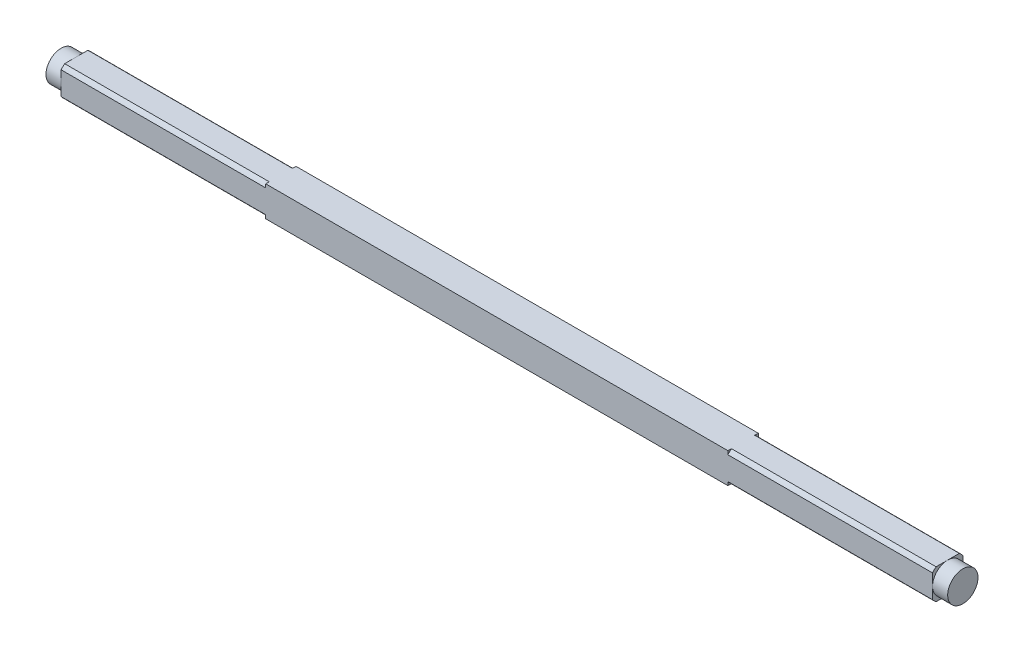
ISO-10303-21;
HEADER;
FILE_DESCRIPTION(('STEP AP214'),'2;1');
FILE_NAME('part.step','',(''),(''),'','','');
FILE_SCHEMA(('AUTOMOTIVE_DESIGN { 1 0 10303 214 1 1 1 1 }'));
ENDSEC;
DATA;
#1=APPLICATION_CONTEXT('core data for automotive mechanical design processes');
#2=APPLICATION_PROTOCOL_DEFINITION('international standard','automotive_design',2000,#1);
#3=PRODUCT_CONTEXT('',#1,'mechanical');
#4=PRODUCT('Part','Part','',(#3));
#5=PRODUCT_RELATED_PRODUCT_CATEGORY('part','',(#4));
#6=PRODUCT_DEFINITION_FORMATION('','',#4);
#7=PRODUCT_DEFINITION_CONTEXT('part definition',#1,'design');
#8=PRODUCT_DEFINITION('design','',#6,#7);
#9=PRODUCT_DEFINITION_SHAPE('','',#8);
#10=(LENGTH_UNIT() NAMED_UNIT(*) SI_UNIT(.MILLI.,.METRE.));
#11=(NAMED_UNIT(*) PLANE_ANGLE_UNIT() SI_UNIT($,.RADIAN.));
#12=(NAMED_UNIT(*) SI_UNIT($,.STERADIAN.) SOLID_ANGLE_UNIT());
#13=UNCERTAINTY_MEASURE_WITH_UNIT(LENGTH_MEASURE(1.E-05),#10,'distance_accuracy_value','');
#14=(GEOMETRIC_REPRESENTATION_CONTEXT(3) GLOBAL_UNCERTAINTY_ASSIGNED_CONTEXT((#13)) GLOBAL_UNIT_ASSIGNED_CONTEXT((#10,
#11,#12)) REPRESENTATION_CONTEXT('',''));
#15=CARTESIAN_POINT('',(0.,0.,0.));
#16=DIRECTION('',(0.,0.,1.));
#17=DIRECTION('',(1.,0.,0.));
#18=AXIS2_PLACEMENT_3D('',#15,#16,#17);
#19=CARTESIAN_POINT('',(94.45625,-3.175,3.175));
#20=DIRECTION('',(0.,0.,-1.));
#21=DIRECTION('',(-1.,0.,0.));
#22=AXIS2_PLACEMENT_3D('',#19,#20,#21);
#23=PLANE('',#22);
#24=DIRECTION('',(0.,-1.,0.));
#25=VECTOR('',#24,1.);
#26=CARTESIAN_POINT('',(48.41875,3.175,3.175));
#27=LINE('',#26,#25);
#28=CARTESIAN_POINT('',(48.41875,3.175,3.175));
#29=VERTEX_POINT('',#28);
#30=CARTESIAN_POINT('',(48.41875,2.43297657202037,3.175));
#31=VERTEX_POINT('',#30);
#32=EDGE_CURVE('E263',#29,#31,#27,.T.);
#33=ORIENTED_EDGE('',*,*,#32,.F.);
#34=DIRECTION('',(-1.,0.,0.));
#35=VECTOR('',#34,1.);
#36=CARTESIAN_POINT('',(94.45625,3.175,3.175));
#37=LINE('',#36,#35);
#38=CARTESIAN_POINT('',(-48.41875,3.175,3.175));
#39=VERTEX_POINT('',#38);
#40=EDGE_CURVE('E314',#29,#39,#37,.T.);
#41=ORIENTED_EDGE('',*,*,#40,.T.);
#42=DIRECTION('',(0.,-1.,0.));
#43=VECTOR('',#42,1.);
#44=CARTESIAN_POINT('',(-48.41875,3.175,3.175));
#45=LINE('',#44,#43);
#46=CARTESIAN_POINT('',(-48.41875,2.43297657202037,3.175));
#47=VERTEX_POINT('',#46);
#48=EDGE_CURVE('E348',#39,#47,#45,.T.);
#49=ORIENTED_EDGE('',*,*,#48,.T.);
#50=DIRECTION('',(-1.,0.,0.));
#51=VECTOR('',#50,1.);
#52=CARTESIAN_POINT('',(-48.41875,2.43297657202037,3.175));
#53=LINE('',#52,#51);
#54=CARTESIAN_POINT('',(-91.28125,2.43297657202037,3.175));
#55=VERTEX_POINT('',#54);
#56=EDGE_CURVE('E358',#47,#55,#53,.T.);
#57=ORIENTED_EDGE('',*,*,#56,.T.);
#58=DIRECTION('',(0.,-1.,0.));
#59=VECTOR('',#58,1.);
#60=CARTESIAN_POINT('',(-91.28125,-3.175,3.175));
#61=LINE('',#60,#59);
#62=CARTESIAN_POINT('',(-91.28125,0.,3.175));
#63=VERTEX_POINT('',#62);
#64=EDGE_CURVE('E230',#55,#63,#61,.T.);
#65=ORIENTED_EDGE('',*,*,#64,.T.);
#66=CARTESIAN_POINT('',(-91.28125,-2.43297657202037,3.175));
#67=VERTEX_POINT('',#66);
#68=EDGE_CURVE('E204',#63,#67,#61,.T.);
#69=ORIENTED_EDGE('',*,*,#68,.T.);
#70=DIRECTION('',(-1.,0.,0.));
#71=VECTOR('',#70,1.);
#72=CARTESIAN_POINT('',(-48.41875,-2.43297657202037,3.175));
#73=LINE('',#72,#71);
#74=CARTESIAN_POINT('',(-48.41875,-2.43297657202037,3.175));
#75=VERTEX_POINT('',#74);
#76=EDGE_CURVE('E214',#75,#67,#73,.T.);
#77=ORIENTED_EDGE('',*,*,#76,.F.);
#78=DIRECTION('',(0.,-1.,0.));
#79=VECTOR('',#78,1.);
#80=CARTESIAN_POINT('',(-48.41875,-2.43297657202037,3.175));
#81=LINE('',#80,#79);
#82=CARTESIAN_POINT('',(-48.41875,-3.175,3.175));
#83=VERTEX_POINT('',#82);
#84=EDGE_CURVE('E450',#75,#83,#81,.T.);
#85=ORIENTED_EDGE('',*,*,#84,.T.);
#86=DIRECTION('',(-1.,0.,0.));
#87=VECTOR('',#86,1.);
#88=CARTESIAN_POINT('',(94.45625,-3.175,3.175));
#89=LINE('',#88,#87);
#90=CARTESIAN_POINT('',(48.41875,-3.175,3.175));
#91=VERTEX_POINT('',#90);
#92=EDGE_CURVE('E317',#91,#83,#89,.T.);
#93=ORIENTED_EDGE('',*,*,#92,.F.);
#94=DIRECTION('',(0.,-1.,0.));
#95=VECTOR('',#94,1.);
#96=CARTESIAN_POINT('',(48.41875,-2.43297657202037,3.175));
#97=LINE('',#96,#95);
#98=CARTESIAN_POINT('',(48.41875,-2.43297657202037,3.175));
#99=VERTEX_POINT('',#98);
#100=EDGE_CURVE('E236',#99,#91,#97,.T.);
#101=ORIENTED_EDGE('',*,*,#100,.F.);
#102=DIRECTION('',(1.,0.,0.));
#103=VECTOR('',#102,1.);
#104=CARTESIAN_POINT('',(48.41875,-2.43297657202037,3.175));
#105=LINE('',#104,#103);
#106=CARTESIAN_POINT('',(91.28125,-2.43297657202037,3.175));
#107=VERTEX_POINT('',#106);
#108=EDGE_CURVE('E239',#99,#107,#105,.T.);
#109=ORIENTED_EDGE('',*,*,#108,.T.);
#110=DIRECTION('',(0.,-1.,0.));
#111=VECTOR('',#110,1.);
#112=CARTESIAN_POINT('',(91.28125,-3.175,3.175));
#113=LINE('',#112,#111);
#114=CARTESIAN_POINT('',(91.28125,0.,3.175));
#115=VERTEX_POINT('',#114);
#116=EDGE_CURVE('E309',#115,#107,#113,.T.);
#117=ORIENTED_EDGE('',*,*,#116,.F.);
#118=CARTESIAN_POINT('',(91.28125,2.43297657202037,3.175));
#119=VERTEX_POINT('',#118);
#120=EDGE_CURVE('E311',#119,#115,#113,.T.);
#121=ORIENTED_EDGE('',*,*,#120,.F.);
#122=DIRECTION('',(1.,0.,0.));
#123=VECTOR('',#122,1.);
#124=CARTESIAN_POINT('',(48.41875,2.43297657202037,3.175));
#125=LINE('',#124,#123);
#126=EDGE_CURVE('E52',#31,#119,#125,.T.);
#127=ORIENTED_EDGE('',*,*,#126,.F.);
#128=EDGE_LOOP('',(#33,#41,#49,#57,#65,#69,#77,#85,#93,#101,#109,#117,#121,#127));
#129=FACE_BOUND('',#128,.T.);
#130=ADVANCED_FACE('F39',(#129),#23,.F.);
#131=CARTESIAN_POINT('',(94.45625,-3.175,-3.175));
#132=DIRECTION('',(0.,1.,0.));
#133=DIRECTION('',(0.,0.,1.));
#134=AXIS2_PLACEMENT_3D('',#131,#132,#133);
#135=PLANE('',#134);
#136=DIRECTION('',(0.,0.,-1.));
#137=VECTOR('',#136,1.);
#138=CARTESIAN_POINT('',(48.41875,-3.175,-2.43297657202037));
#139=LINE('',#138,#137);
#140=CARTESIAN_POINT('',(48.41875,-3.175,-2.43297657202037));
#141=VERTEX_POINT('',#140);
#142=CARTESIAN_POINT('',(48.41875,-3.175,-3.175));
#143=VERTEX_POINT('',#142);
#144=EDGE_CURVE('E268',#141,#143,#139,.T.);
#145=ORIENTED_EDGE('',*,*,#144,.F.);
#146=DIRECTION('',(1.,0.,0.));
#147=VECTOR('',#146,1.);
#148=CARTESIAN_POINT('',(48.41875,-3.175,-2.43297657202037));
#149=LINE('',#148,#147);
#150=CARTESIAN_POINT('',(91.28125,-3.175,-2.43297657202037));
#151=VERTEX_POINT('',#150);
#152=EDGE_CURVE('E267',#141,#151,#149,.T.);
#153=ORIENTED_EDGE('',*,*,#152,.T.);
#154=DIRECTION('',(0.,0.,-1.));
#155=VECTOR('',#154,1.);
#156=CARTESIAN_POINT('',(91.28125,-3.175,-3.175));
#157=LINE('',#156,#155);
#158=CARTESIAN_POINT('',(91.28125,-3.175,0.));
#159=VERTEX_POINT('',#158);
#160=EDGE_CURVE('E308',#159,#151,#157,.T.);
#161=ORIENTED_EDGE('',*,*,#160,.F.);
#162=CARTESIAN_POINT('',(91.28125,-3.175,2.43297657202037));
#163=VERTEX_POINT('',#162);
#164=EDGE_CURVE('E310',#163,#159,#157,.T.);
#165=ORIENTED_EDGE('',*,*,#164,.F.);
#166=DIRECTION('',(1.,0.,0.));
#167=VECTOR('',#166,1.);
#168=CARTESIAN_POINT('',(48.41875,-3.175,2.43297657202038));
#169=LINE('',#168,#167);
#170=CARTESIAN_POINT('',(48.41875,-3.175,2.43297657202038));
#171=VERTEX_POINT('',#170);
#172=EDGE_CURVE('E61',#171,#163,#169,.T.);
#173=ORIENTED_EDGE('',*,*,#172,.F.);
#174=DIRECTION('',(0.,0.,-1.));
#175=VECTOR('',#174,1.);
#176=CARTESIAN_POINT('',(48.41875,-3.175,3.175));
#177=LINE('',#176,#175);
#178=EDGE_CURVE('E248',#91,#171,#177,.T.);
#179=ORIENTED_EDGE('',*,*,#178,.F.);
#180=ORIENTED_EDGE('',*,*,#92,.T.);
#181=DIRECTION('',(0.,0.,-1.));
#182=VECTOR('',#181,1.);
#183=CARTESIAN_POINT('',(-48.41875,-3.175,3.175));
#184=LINE('',#183,#182);
#185=CARTESIAN_POINT('',(-48.41875,-3.175,2.43297657202038));
#186=VERTEX_POINT('',#185);
#187=EDGE_CURVE('E215',#83,#186,#184,.T.);
#188=ORIENTED_EDGE('',*,*,#187,.T.);
#189=DIRECTION('',(-1.,0.,0.));
#190=VECTOR('',#189,1.);
#191=CARTESIAN_POINT('',(-48.41875,-3.175,2.43297657202038));
#192=LINE('',#191,#190);
#193=CARTESIAN_POINT('',(-91.28125,-3.175,2.43297657202037));
#194=VERTEX_POINT('',#193);
#195=EDGE_CURVE('E222',#186,#194,#192,.T.);
#196=ORIENTED_EDGE('',*,*,#195,.T.);
#197=DIRECTION('',(0.,0.,-1.));
#198=VECTOR('',#197,1.);
#199=CARTESIAN_POINT('',(-91.28125,-3.175,-3.175));
#200=LINE('',#199,#198);
#201=CARTESIAN_POINT('',(-91.28125,-3.175,0.));
#202=VERTEX_POINT('',#201);
#203=EDGE_CURVE('E210',#194,#202,#200,.T.);
#204=ORIENTED_EDGE('',*,*,#203,.T.);
#205=CARTESIAN_POINT('',(-91.28125,-3.175,-2.43297657202037));
#206=VERTEX_POINT('',#205);
#207=EDGE_CURVE('E229',#202,#206,#200,.T.);
#208=ORIENTED_EDGE('',*,*,#207,.T.);
#209=DIRECTION('',(-1.,0.,0.));
#210=VECTOR('',#209,1.);
#211=CARTESIAN_POINT('',(-48.41875,-3.175,-2.43297657202037));
#212=LINE('',#211,#210);
#213=CARTESIAN_POINT('',(-48.41875,-3.175,-2.43297657202037));
#214=VERTEX_POINT('',#213);
#215=EDGE_CURVE('E365',#214,#206,#212,.T.);
#216=ORIENTED_EDGE('',*,*,#215,.F.);
#217=DIRECTION('',(0.,0.,-1.));
#218=VECTOR('',#217,1.);
#219=CARTESIAN_POINT('',(-48.41875,-3.175,-2.43297657202037));
#220=LINE('',#219,#218);
#221=CARTESIAN_POINT('',(-48.41875,-3.175,-3.175));
#222=VERTEX_POINT('',#221);
#223=EDGE_CURVE('E361',#214,#222,#220,.T.);
#224=ORIENTED_EDGE('',*,*,#223,.T.);
#225=DIRECTION('',(-1.,0.,0.));
#226=VECTOR('',#225,1.);
#227=CARTESIAN_POINT('',(94.45625,-3.175,-3.175));
#228=LINE('',#227,#226);
#229=EDGE_CURVE('E318',#143,#222,#228,.T.);
#230=ORIENTED_EDGE('',*,*,#229,.F.);
#231=EDGE_LOOP('',(#145,#153,#161,#165,#173,#179,#180,#188,#196,#204,#208,#216,#224,#230));
#232=FACE_BOUND('',#231,.T.);
#233=ADVANCED_FACE('F408',(#232),#135,.F.);
#234=CARTESIAN_POINT('',(94.45625,-3.175,-3.175));
#235=DIRECTION('',(0.,0.,1.));
#236=DIRECTION('',(1.,0.,0.));
#237=AXIS2_PLACEMENT_3D('',#234,#235,#236);
#238=PLANE('',#237);
#239=DIRECTION('',(0.,1.,0.));
#240=VECTOR('',#239,1.);
#241=CARTESIAN_POINT('',(48.41875,-3.175,-3.175));
#242=LINE('',#241,#240);
#243=CARTESIAN_POINT('',(48.41875,-2.43297657202037,-3.175));
#244=VERTEX_POINT('',#243);
#245=EDGE_CURVE('E272',#143,#244,#242,.T.);
#246=ORIENTED_EDGE('',*,*,#245,.F.);
#247=ORIENTED_EDGE('',*,*,#229,.T.);
#248=DIRECTION('',(0.,1.,0.));
#249=VECTOR('',#248,1.);
#250=CARTESIAN_POINT('',(-48.41875,-3.175,-3.175));
#251=LINE('',#250,#249);
#252=CARTESIAN_POINT('',(-48.41875,-2.43297657202037,-3.175));
#253=VERTEX_POINT('',#252);
#254=EDGE_CURVE('E369',#222,#253,#251,.T.);
#255=ORIENTED_EDGE('',*,*,#254,.T.);
#256=DIRECTION('',(-1.,0.,0.));
#257=VECTOR('',#256,1.);
#258=CARTESIAN_POINT('',(-48.41875,-2.43297657202037,-3.175));
#259=LINE('',#258,#257);
#260=CARTESIAN_POINT('',(-91.28125,-2.43297657202037,-3.175));
#261=VERTEX_POINT('',#260);
#262=EDGE_CURVE('E359',#253,#261,#259,.T.);
#263=ORIENTED_EDGE('',*,*,#262,.T.);
#264=DIRECTION('',(0.,1.,0.));
#265=VECTOR('',#264,1.);
#266=CARTESIAN_POINT('',(-91.28125,-3.175,-3.175));
#267=LINE('',#266,#265);
#268=CARTESIAN_POINT('',(-91.28125,0.,-3.175));
#269=VERTEX_POINT('',#268);
#270=EDGE_CURVE('E397',#261,#269,#267,.T.);
#271=ORIENTED_EDGE('',*,*,#270,.T.);
#272=CARTESIAN_POINT('',(-91.28125,2.43297657202037,-3.175));
#273=VERTEX_POINT('',#272);
#274=EDGE_CURVE('E393',#269,#273,#267,.T.);
#275=ORIENTED_EDGE('',*,*,#274,.T.);
#276=DIRECTION('',(-1.,0.,0.));
#277=VECTOR('',#276,1.);
#278=CARTESIAN_POINT('',(-48.41875,2.43297657202037,-3.175));
#279=LINE('',#278,#277);
#280=CARTESIAN_POINT('',(-48.41875,2.43297657202037,-3.175));
#281=VERTEX_POINT('',#280);
#282=EDGE_CURVE('E383',#281,#273,#279,.T.);
#283=ORIENTED_EDGE('',*,*,#282,.F.);
#284=DIRECTION('',(0.,1.,0.));
#285=VECTOR('',#284,1.);
#286=CARTESIAN_POINT('',(-48.41875,2.43297657202037,-3.175));
#287=LINE('',#286,#285);
#288=CARTESIAN_POINT('',(-48.41875,3.175,-3.175));
#289=VERTEX_POINT('',#288);
#290=EDGE_CURVE('E378',#281,#289,#287,.T.);
#291=ORIENTED_EDGE('',*,*,#290,.T.);
#292=DIRECTION('',(-1.,0.,0.));
#293=VECTOR('',#292,1.);
#294=CARTESIAN_POINT('',(94.45625,3.175,-3.175));
#295=LINE('',#294,#293);
#296=CARTESIAN_POINT('',(48.41875,3.175,-3.175));
#297=VERTEX_POINT('',#296);
#298=EDGE_CURVE('E316',#297,#289,#295,.T.);
#299=ORIENTED_EDGE('',*,*,#298,.F.);
#300=DIRECTION('',(0.,1.,0.));
#301=VECTOR('',#300,1.);
#302=CARTESIAN_POINT('',(48.41875,2.43297657202037,-3.175));
#303=LINE('',#302,#301);
#304=CARTESIAN_POINT('',(48.41875,2.43297657202037,-3.175));
#305=VERTEX_POINT('',#304);
#306=EDGE_CURVE('E282',#305,#297,#303,.T.);
#307=ORIENTED_EDGE('',*,*,#306,.F.);
#308=DIRECTION('',(1.,0.,0.));
#309=VECTOR('',#308,1.);
#310=CARTESIAN_POINT('',(48.41875,2.43297657202037,-3.175));
#311=LINE('',#310,#309);
#312=CARTESIAN_POINT('',(91.28125,2.43297657202037,-3.175));
#313=VERTEX_POINT('',#312);
#314=EDGE_CURVE('E286',#305,#313,#311,.T.);
#315=ORIENTED_EDGE('',*,*,#314,.T.);
#316=DIRECTION('',(0.,1.,0.));
#317=VECTOR('',#316,1.);
#318=CARTESIAN_POINT('',(91.28125,-3.175,-3.175));
#319=LINE('',#318,#317);
#320=CARTESIAN_POINT('',(91.28125,0.,-3.175));
#321=VERTEX_POINT('',#320);
#322=EDGE_CURVE('E297',#321,#313,#319,.T.);
#323=ORIENTED_EDGE('',*,*,#322,.F.);
#324=CARTESIAN_POINT('',(91.28125,-2.43297657202037,-3.175));
#325=VERTEX_POINT('',#324);
#326=EDGE_CURVE('E304',#325,#321,#319,.T.);
#327=ORIENTED_EDGE('',*,*,#326,.F.);
#328=DIRECTION('',(1.,0.,0.));
#329=VECTOR('',#328,1.);
#330=CARTESIAN_POINT('',(48.41875,-2.43297657202037,-3.175));
#331=LINE('',#330,#329);
#332=EDGE_CURVE('E266',#244,#325,#331,.T.);
#333=ORIENTED_EDGE('',*,*,#332,.F.);
#334=EDGE_LOOP('',(#246,#247,#255,#263,#271,#275,#283,#291,#299,#307,#315,#323,#327,#333));
#335=FACE_BOUND('',#334,.T.);
#336=ADVANCED_FACE('F425',(#335),#238,.F.);
#337=CARTESIAN_POINT('',(94.45625,3.175,-3.175));
#338=DIRECTION('',(0.,-1.,0.));
#339=DIRECTION('',(0.,0.,-1.));
#340=AXIS2_PLACEMENT_3D('',#337,#338,#339);
#341=PLANE('',#340);
#342=DIRECTION('',(0.,0.,1.));
#343=VECTOR('',#342,1.);
#344=CARTESIAN_POINT('',(48.41875,3.175,2.43297657202037));
#345=LINE('',#344,#343);
#346=CARTESIAN_POINT('',(48.41875,3.175,2.43297657202037));
#347=VERTEX_POINT('',#346);
#348=EDGE_CURVE('E257',#347,#29,#345,.T.);
#349=ORIENTED_EDGE('',*,*,#348,.F.);
#350=DIRECTION('',(1.,0.,0.));
#351=VECTOR('',#350,1.);
#352=CARTESIAN_POINT('',(48.41875,3.175,2.43297657202037));
#353=LINE('',#352,#351);
#354=CARTESIAN_POINT('',(91.28125,3.175,2.43297657202037));
#355=VERTEX_POINT('',#354);
#356=EDGE_CURVE('E254',#347,#355,#353,.T.);
#357=ORIENTED_EDGE('',*,*,#356,.T.);
#358=DIRECTION('',(0.,0.,1.));
#359=VECTOR('',#358,1.);
#360=CARTESIAN_POINT('',(91.28125,3.175,-3.175));
#361=LINE('',#360,#359);
#362=CARTESIAN_POINT('',(91.28125,3.175,0.));
#363=VERTEX_POINT('',#362);
#364=EDGE_CURVE('E45',#363,#355,#361,.T.);
#365=ORIENTED_EDGE('',*,*,#364,.F.);
#366=CARTESIAN_POINT('',(91.28125,3.175,-2.43297657202037));
#367=VERTEX_POINT('',#366);
#368=EDGE_CURVE('E11',#367,#363,#361,.T.);
#369=ORIENTED_EDGE('',*,*,#368,.F.);
#370=DIRECTION('',(1.,0.,0.));
#371=VECTOR('',#370,1.);
#372=CARTESIAN_POINT('',(48.41875,3.175,-2.43297657202037));
#373=LINE('',#372,#371);
#374=CARTESIAN_POINT('',(48.41875,3.175,-2.43297657202037));
#375=VERTEX_POINT('',#374);
#376=EDGE_CURVE('E289',#375,#367,#373,.T.);
#377=ORIENTED_EDGE('',*,*,#376,.F.);
#378=DIRECTION('',(0.,0.,1.));
#379=VECTOR('',#378,1.);
#380=CARTESIAN_POINT('',(48.41875,3.175,-3.175));
#381=LINE('',#380,#379);
#382=EDGE_CURVE('E284',#297,#375,#381,.T.);
#383=ORIENTED_EDGE('',*,*,#382,.F.);
#384=ORIENTED_EDGE('',*,*,#298,.T.);
#385=DIRECTION('',(0.,0.,1.));
#386=VECTOR('',#385,1.);
#387=CARTESIAN_POINT('',(-48.41875,3.175,-3.175));
#388=LINE('',#387,#386);
#389=CARTESIAN_POINT('',(-48.41875,3.175,-2.43297657202037));
#390=VERTEX_POINT('',#389);
#391=EDGE_CURVE('E381',#289,#390,#388,.T.);
#392=ORIENTED_EDGE('',*,*,#391,.T.);
#393=DIRECTION('',(-1.,0.,0.));
#394=VECTOR('',#393,1.);
#395=CARTESIAN_POINT('',(-48.41875,3.175,-2.43297657202037));
#396=LINE('',#395,#394);
#397=CARTESIAN_POINT('',(-91.28125,3.175,-2.43297657202037));
#398=VERTEX_POINT('',#397);
#399=EDGE_CURVE('E387',#390,#398,#396,.T.);
#400=ORIENTED_EDGE('',*,*,#399,.T.);
#401=DIRECTION('',(0.,0.,1.));
#402=VECTOR('',#401,1.);
#403=CARTESIAN_POINT('',(-91.28125,3.175,-3.175));
#404=LINE('',#403,#402);
#405=CARTESIAN_POINT('',(-91.28125,3.175,0.));
#406=VERTEX_POINT('',#405);
#407=EDGE_CURVE('E237',#398,#406,#404,.T.);
#408=ORIENTED_EDGE('',*,*,#407,.T.);
#409=CARTESIAN_POINT('',(-91.28125,3.175,2.43297657202037));
#410=VERTEX_POINT('',#409);
#411=EDGE_CURVE('E228',#406,#410,#404,.T.);
#412=ORIENTED_EDGE('',*,*,#411,.T.);
#413=DIRECTION('',(-1.,0.,0.));
#414=VECTOR('',#413,1.);
#415=CARTESIAN_POINT('',(-48.41875,3.175,2.43297657202037));
#416=LINE('',#415,#414);
#417=CARTESIAN_POINT('',(-48.41875,3.175,2.43297657202037));
#418=VERTEX_POINT('',#417);
#419=EDGE_CURVE('E346',#418,#410,#416,.T.);
#420=ORIENTED_EDGE('',*,*,#419,.F.);
#421=DIRECTION('',(0.,0.,1.));
#422=VECTOR('',#421,1.);
#423=CARTESIAN_POINT('',(-48.41875,3.175,2.43297657202037));
#424=LINE('',#423,#422);
#425=EDGE_CURVE('E344',#418,#39,#424,.T.);
#426=ORIENTED_EDGE('',*,*,#425,.T.);
#427=ORIENTED_EDGE('',*,*,#40,.F.);
#428=EDGE_LOOP('',(#349,#357,#365,#369,#377,#383,#384,#392,#400,#408,#412,#420,#426,#427));
#429=FACE_BOUND('',#428,.T.);
#430=ADVANCED_FACE('F333',(#429),#341,.F.);
#431=CARTESIAN_POINT('',(91.28125,0.,0.));
#432=DIRECTION('',(1.,0.,0.));
#433=DIRECTION('',(0.,0.,-1.));
#434=AXIS2_PLACEMENT_3D('',#431,#432,#433);
#435=PLANE('',#434);
#436=CARTESIAN_POINT('',(91.28125,0.,0.));
#437=DIRECTION('',(-1.,0.,0.));
#438=DIRECTION('',(0.,0.,-1.));
#439=AXIS2_PLACEMENT_3D('',#436,#437,#438);
#440=CIRCLE('',#439,4.);
#441=EDGE_CURVE('E245',#119,#355,#440,.T.);
#442=ORIENTED_EDGE('',*,*,#441,.F.);
#443=ORIENTED_EDGE('',*,*,#120,.T.);
#444=CARTESIAN_POINT('',(91.28125,0.,0.));
#445=DIRECTION('',(1.,0.,0.));
#446=DIRECTION('',(0.,0.,-1.));
#447=AXIS2_PLACEMENT_3D('',#444,#445,#446);
#448=CIRCLE('',#447,3.175);
#449=EDGE_CURVE('E298',#363,#115,#448,.T.);
#450=ORIENTED_EDGE('',*,*,#449,.F.);
#451=ORIENTED_EDGE('',*,*,#364,.T.);
#452=EDGE_LOOP('',(#442,#443,#450,#451));
#453=FACE_BOUND('',#452,.T.);
#454=ADVANCED_FACE('F328',(#453),#435,.T.);
#455=CARTESIAN_POINT('',(91.28125,0.,0.));
#456=DIRECTION('',(-1.,0.,0.));
#457=DIRECTION('',(0.,0.,-1.));
#458=AXIS2_PLACEMENT_3D('',#455,#456,#457);
#459=CIRCLE('',#458,4.);
#460=EDGE_CURVE('E242',#163,#107,#459,.T.);
#461=ORIENTED_EDGE('',*,*,#460,.F.);
#462=ORIENTED_EDGE('',*,*,#164,.T.);
#463=EDGE_CURVE('E438',#115,#159,#448,.T.);
#464=ORIENTED_EDGE('',*,*,#463,.F.);
#465=ORIENTED_EDGE('',*,*,#116,.T.);
#466=EDGE_LOOP('',(#461,#462,#464,#465));
#467=FACE_BOUND('',#466,.T.);
#468=ADVANCED_FACE('F441',(#467),#435,.T.);
#469=CARTESIAN_POINT('',(91.28125,0.,0.));
#470=DIRECTION('',(-1.,0.,0.));
#471=DIRECTION('',(0.,0.,-1.));
#472=AXIS2_PLACEMENT_3D('',#469,#470,#471);
#473=CIRCLE('',#472,4.);
#474=EDGE_CURVE('E256',#325,#151,#473,.T.);
#475=ORIENTED_EDGE('',*,*,#474,.F.);
#476=ORIENTED_EDGE('',*,*,#326,.T.);
#477=EDGE_CURVE('E299',#159,#321,#448,.T.);
#478=ORIENTED_EDGE('',*,*,#477,.F.);
#479=ORIENTED_EDGE('',*,*,#160,.T.);
#480=EDGE_LOOP('',(#475,#476,#478,#479));
#481=FACE_BOUND('',#480,.T.);
#482=ADVANCED_FACE('F432',(#481),#435,.T.);
#483=CARTESIAN_POINT('',(91.28125,0.,0.));
#484=DIRECTION('',(-1.,0.,0.));
#485=DIRECTION('',(0.,0.,-1.));
#486=AXIS2_PLACEMENT_3D('',#483,#484,#485);
#487=CIRCLE('',#486,4.);
#488=EDGE_CURVE('E244',#367,#313,#487,.T.);
#489=ORIENTED_EDGE('',*,*,#488,.F.);
#490=ORIENTED_EDGE('',*,*,#368,.T.);
#491=EDGE_CURVE('E293',#321,#363,#448,.T.);
#492=ORIENTED_EDGE('',*,*,#491,.F.);
#493=ORIENTED_EDGE('',*,*,#322,.T.);
#494=EDGE_LOOP('',(#489,#490,#492,#493));
#495=FACE_BOUND('',#494,.T.);
#496=ADVANCED_FACE('F505',(#495),#435,.T.);
#497=CARTESIAN_POINT('',(91.28125,0.,0.));
#498=DIRECTION('',(1.,0.,0.));
#499=DIRECTION('',(0.,0.,-1.));
#500=AXIS2_PLACEMENT_3D('',#497,#498,#499);
#501=CYLINDRICAL_SURFACE('',#500,3.175);
#502=CARTESIAN_POINT('',(94.45625,0.,0.));
#503=DIRECTION('',(1.,0.,0.));
#504=DIRECTION('',(0.,0.,-1.));
#505=AXIS2_PLACEMENT_3D('',#502,#503,#504);
#506=CIRCLE('',#505,3.175);
#507=CARTESIAN_POINT('',(94.45625,0.,-3.175));
#508=VERTEX_POINT('',#507);
#509=EDGE_CURVE('E295',#508,#508,#506,.T.);
#510=ORIENTED_EDGE('',*,*,#509,.F.);
#511=EDGE_LOOP('',(#510));
#512=FACE_BOUND('',#511,.T.);
#513=ORIENTED_EDGE('',*,*,#449,.T.);
#514=ORIENTED_EDGE('',*,*,#463,.T.);
#515=ORIENTED_EDGE('',*,*,#477,.T.);
#516=ORIENTED_EDGE('',*,*,#491,.T.);
#517=EDGE_LOOP('',(#513,#514,#515,#516));
#518=FACE_BOUND('',#517,.T.);
#519=ADVANCED_FACE('F442',(#512,#518),#501,.T.);
#520=CARTESIAN_POINT('',(94.45625,0.,0.));
#521=DIRECTION('',(1.,0.,0.));
#522=DIRECTION('',(0.,0.,-1.));
#523=AXIS2_PLACEMENT_3D('',#520,#521,#522);
#524=PLANE('',#523);
#525=ORIENTED_EDGE('',*,*,#509,.T.);
#526=EDGE_LOOP('',(#525));
#527=FACE_BOUND('',#526,.T.);
#528=ADVANCED_FACE('F494',(#527),#524,.T.);
#529=CARTESIAN_POINT('',(48.41875,0.,0.));
#530=DIRECTION('',(1.,0.,0.));
#531=DIRECTION('',(0.,0.,-1.));
#532=AXIS2_PLACEMENT_3D('',#529,#530,#531);
#533=CYLINDRICAL_SURFACE('',#532,4.);
#534=ORIENTED_EDGE('',*,*,#488,.T.);
#535=ORIENTED_EDGE('',*,*,#314,.F.);
#536=CARTESIAN_POINT('',(48.41875,0.,0.));
#537=DIRECTION('',(-1.,0.,0.));
#538=DIRECTION('',(0.,0.,-1.));
#539=AXIS2_PLACEMENT_3D('',#536,#537,#538);
#540=CIRCLE('',#539,4.);
#541=EDGE_CURVE('E278',#375,#305,#540,.T.);
#542=ORIENTED_EDGE('',*,*,#541,.F.);
#543=ORIENTED_EDGE('',*,*,#376,.T.);
#544=EDGE_LOOP('',(#534,#535,#542,#543));
#545=FACE_BOUND('',#544,.T.);
#546=ADVANCED_FACE('F499',(#545),#533,.T.);
#547=CARTESIAN_POINT('',(48.41875,0.,0.));
#548=DIRECTION('',(1.,0.,0.));
#549=DIRECTION('',(0.,0.,-1.));
#550=AXIS2_PLACEMENT_3D('',#547,#548,#549);
#551=PLANE('',#550);
#552=ORIENTED_EDGE('',*,*,#541,.T.);
#553=ORIENTED_EDGE('',*,*,#306,.T.);
#554=ORIENTED_EDGE('',*,*,#382,.T.);
#555=EDGE_LOOP('',(#552,#553,#554));
#556=FACE_BOUND('',#555,.T.);
#557=ADVANCED_FACE('F506',(#556),#551,.T.);
#558=CARTESIAN_POINT('',(48.41875,0.,0.));
#559=DIRECTION('',(1.,0.,0.));
#560=DIRECTION('',(0.,0.,-1.));
#561=AXIS2_PLACEMENT_3D('',#558,#559,#560);
#562=CYLINDRICAL_SURFACE('',#561,4.);
#563=ORIENTED_EDGE('',*,*,#474,.T.);
#564=ORIENTED_EDGE('',*,*,#152,.F.);
#565=CARTESIAN_POINT('',(48.41875,0.,0.));
#566=DIRECTION('',(-1.,0.,0.));
#567=DIRECTION('',(0.,0.,-1.));
#568=AXIS2_PLACEMENT_3D('',#565,#566,#567);
#569=CIRCLE('',#568,4.);
#570=EDGE_CURVE('E274',#244,#141,#569,.T.);
#571=ORIENTED_EDGE('',*,*,#570,.F.);
#572=ORIENTED_EDGE('',*,*,#332,.T.);
#573=EDGE_LOOP('',(#563,#564,#571,#572));
#574=FACE_BOUND('',#573,.T.);
#575=ADVANCED_FACE('F428',(#574),#562,.T.);
#576=CARTESIAN_POINT('',(48.41875,0.,0.));
#577=DIRECTION('',(1.,0.,0.));
#578=DIRECTION('',(0.,0.,-1.));
#579=AXIS2_PLACEMENT_3D('',#576,#577,#578);
#580=PLANE('',#579);
#581=ORIENTED_EDGE('',*,*,#245,.T.);
#582=ORIENTED_EDGE('',*,*,#570,.T.);
#583=ORIENTED_EDGE('',*,*,#144,.T.);
#584=EDGE_LOOP('',(#581,#582,#583));
#585=FACE_BOUND('',#584,.T.);
#586=ADVANCED_FACE('F426',(#585),#580,.T.);
#587=CARTESIAN_POINT('',(48.41875,0.,0.));
#588=DIRECTION('',(1.,0.,0.));
#589=DIRECTION('',(0.,0.,-1.));
#590=AXIS2_PLACEMENT_3D('',#587,#588,#589);
#591=CYLINDRICAL_SURFACE('',#590,4.);
#592=ORIENTED_EDGE('',*,*,#460,.T.);
#593=ORIENTED_EDGE('',*,*,#108,.F.);
#594=CARTESIAN_POINT('',(48.41875,0.,0.));
#595=DIRECTION('',(-1.,0.,0.));
#596=DIRECTION('',(0.,0.,-1.));
#597=AXIS2_PLACEMENT_3D('',#594,#595,#596);
#598=CIRCLE('',#597,4.);
#599=EDGE_CURVE('E246',#171,#99,#598,.T.);
#600=ORIENTED_EDGE('',*,*,#599,.F.);
#601=ORIENTED_EDGE('',*,*,#172,.T.);
#602=EDGE_LOOP('',(#592,#593,#600,#601));
#603=FACE_BOUND('',#602,.T.);
#604=ADVANCED_FACE('F513',(#603),#591,.T.);
#605=CARTESIAN_POINT('',(48.41875,0.,0.));
#606=DIRECTION('',(1.,0.,0.));
#607=DIRECTION('',(0.,0.,-1.));
#608=AXIS2_PLACEMENT_3D('',#605,#606,#607);
#609=PLANE('',#608);
#610=ORIENTED_EDGE('',*,*,#178,.T.);
#611=ORIENTED_EDGE('',*,*,#599,.T.);
#612=ORIENTED_EDGE('',*,*,#100,.T.);
#613=EDGE_LOOP('',(#610,#611,#612));
#614=FACE_BOUND('',#613,.T.);
#615=ADVANCED_FACE('F525',(#614),#609,.T.);
#616=CARTESIAN_POINT('',(48.41875,0.,0.));
#617=DIRECTION('',(1.,0.,0.));
#618=DIRECTION('',(0.,0.,-1.));
#619=AXIS2_PLACEMENT_3D('',#616,#617,#618);
#620=CYLINDRICAL_SURFACE('',#619,4.);
#621=ORIENTED_EDGE('',*,*,#441,.T.);
#622=ORIENTED_EDGE('',*,*,#356,.F.);
#623=CARTESIAN_POINT('',(48.41875,0.,0.));
#624=DIRECTION('',(-1.,0.,0.));
#625=DIRECTION('',(0.,0.,-1.));
#626=AXIS2_PLACEMENT_3D('',#623,#624,#625);
#627=CIRCLE('',#626,4.);
#628=EDGE_CURVE('E255',#31,#347,#627,.T.);
#629=ORIENTED_EDGE('',*,*,#628,.F.);
#630=ORIENTED_EDGE('',*,*,#126,.T.);
#631=EDGE_LOOP('',(#621,#622,#629,#630));
#632=FACE_BOUND('',#631,.T.);
#633=ADVANCED_FACE('F337',(#632),#620,.T.);
#634=CARTESIAN_POINT('',(48.41875,0.,0.));
#635=DIRECTION('',(1.,0.,0.));
#636=DIRECTION('',(0.,0.,-1.));
#637=AXIS2_PLACEMENT_3D('',#634,#635,#636);
#638=PLANE('',#637);
#639=ORIENTED_EDGE('',*,*,#348,.T.);
#640=ORIENTED_EDGE('',*,*,#32,.T.);
#641=ORIENTED_EDGE('',*,*,#628,.T.);
#642=EDGE_LOOP('',(#639,#640,#641));
#643=FACE_BOUND('',#642,.T.);
#644=ADVANCED_FACE('F339',(#643),#638,.T.);
#645=CARTESIAN_POINT('',(-91.28125,0.,0.));
#646=DIRECTION('',(-1.,0.,0.));
#647=DIRECTION('',(0.,0.,-1.));
#648=AXIS2_PLACEMENT_3D('',#645,#646,#647);
#649=PLANE('',#648);
#650=CARTESIAN_POINT('',(-91.28125,0.,0.));
#651=DIRECTION('',(-1.,0.,0.));
#652=DIRECTION('',(0.,0.,-1.));
#653=AXIS2_PLACEMENT_3D('',#650,#651,#652);
#654=CIRCLE('',#653,4.);
#655=EDGE_CURVE('E225',#55,#410,#654,.T.);
#656=ORIENTED_EDGE('',*,*,#655,.T.);
#657=ORIENTED_EDGE('',*,*,#411,.F.);
#658=CARTESIAN_POINT('',(-91.28125,0.,0.));
#659=DIRECTION('',(1.,0.,0.));
#660=DIRECTION('',(0.,0.,-1.));
#661=AXIS2_PLACEMENT_3D('',#658,#659,#660);
#662=CIRCLE('',#661,3.175);
#663=EDGE_CURVE('E394',#406,#63,#662,.T.);
#664=ORIENTED_EDGE('',*,*,#663,.T.);
#665=ORIENTED_EDGE('',*,*,#64,.F.);
#666=EDGE_LOOP('',(#656,#657,#664,#665));
#667=FACE_BOUND('',#666,.T.);
#668=ADVANCED_FACE('F460',(#667),#649,.T.);
#669=CARTESIAN_POINT('',(-91.28125,0.,0.));
#670=DIRECTION('',(-1.,0.,0.));
#671=DIRECTION('',(0.,0.,-1.));
#672=AXIS2_PLACEMENT_3D('',#669,#670,#671);
#673=CIRCLE('',#672,4.);
#674=EDGE_CURVE('E200',#194,#67,#673,.T.);
#675=ORIENTED_EDGE('',*,*,#674,.T.);
#676=ORIENTED_EDGE('',*,*,#68,.F.);
#677=EDGE_CURVE('E467',#63,#202,#662,.T.);
#678=ORIENTED_EDGE('',*,*,#677,.T.);
#679=ORIENTED_EDGE('',*,*,#203,.F.);
#680=EDGE_LOOP('',(#675,#676,#678,#679));
#681=FACE_BOUND('',#680,.T.);
#682=ADVANCED_FACE('F203',(#681),#649,.T.);
#683=CARTESIAN_POINT('',(-91.28125,0.,0.));
#684=DIRECTION('',(-1.,0.,0.));
#685=DIRECTION('',(0.,0.,-1.));
#686=AXIS2_PLACEMENT_3D('',#683,#684,#685);
#687=CIRCLE('',#686,4.);
#688=EDGE_CURVE('E370',#261,#206,#687,.T.);
#689=ORIENTED_EDGE('',*,*,#688,.T.);
#690=ORIENTED_EDGE('',*,*,#207,.F.);
#691=EDGE_CURVE('E398',#202,#269,#662,.T.);
#692=ORIENTED_EDGE('',*,*,#691,.T.);
#693=ORIENTED_EDGE('',*,*,#270,.F.);
#694=EDGE_LOOP('',(#689,#690,#692,#693));
#695=FACE_BOUND('',#694,.T.);
#696=ADVANCED_FACE('F411',(#695),#649,.T.);
#697=CARTESIAN_POINT('',(-91.28125,0.,0.));
#698=DIRECTION('',(-1.,0.,0.));
#699=DIRECTION('',(0.,0.,-1.));
#700=AXIS2_PLACEMENT_3D('',#697,#698,#699);
#701=CIRCLE('',#700,4.);
#702=EDGE_CURVE('E211',#398,#273,#701,.T.);
#703=ORIENTED_EDGE('',*,*,#702,.T.);
#704=ORIENTED_EDGE('',*,*,#274,.F.);
#705=EDGE_CURVE('E395',#269,#406,#662,.T.);
#706=ORIENTED_EDGE('',*,*,#705,.T.);
#707=ORIENTED_EDGE('',*,*,#407,.F.);
#708=EDGE_LOOP('',(#703,#704,#706,#707));
#709=FACE_BOUND('',#708,.T.);
#710=ADVANCED_FACE('F464',(#709),#649,.T.);
#711=CARTESIAN_POINT('',(-91.28125,0.,0.));
#712=DIRECTION('',(-1.,0.,0.));
#713=DIRECTION('',(0.,0.,-1.));
#714=AXIS2_PLACEMENT_3D('',#711,#712,#713);
#715=CYLINDRICAL_SURFACE('',#714,3.175);
#716=CARTESIAN_POINT('',(-94.45625,0.,0.));
#717=DIRECTION('',(1.,0.,0.));
#718=DIRECTION('',(0.,0.,-1.));
#719=AXIS2_PLACEMENT_3D('',#716,#717,#718);
#720=CIRCLE('',#719,3.175);
#721=CARTESIAN_POINT('',(-94.45625,0.,-3.175));
#722=VERTEX_POINT('',#721);
#723=EDGE_CURVE('E386',#722,#722,#720,.T.);
#724=ORIENTED_EDGE('',*,*,#723,.T.);
#725=EDGE_LOOP('',(#724));
#726=FACE_BOUND('',#725,.T.);
#727=ORIENTED_EDGE('',*,*,#663,.F.);
#728=ORIENTED_EDGE('',*,*,#705,.F.);
#729=ORIENTED_EDGE('',*,*,#691,.F.);
#730=ORIENTED_EDGE('',*,*,#677,.F.);
#731=EDGE_LOOP('',(#727,#728,#729,#730));
#732=FACE_BOUND('',#731,.T.);
#733=ADVANCED_FACE('F466',(#726,#732),#715,.T.);
#734=CARTESIAN_POINT('',(-94.45625,0.,0.));
#735=DIRECTION('',(-1.,0.,0.));
#736=DIRECTION('',(0.,0.,-1.));
#737=AXIS2_PLACEMENT_3D('',#734,#735,#736);
#738=PLANE('',#737);
#739=ORIENTED_EDGE('',*,*,#723,.F.);
#740=EDGE_LOOP('',(#739));
#741=FACE_BOUND('',#740,.T.);
#742=ADVANCED_FACE('F473',(#741),#738,.T.);
#743=CARTESIAN_POINT('',(-48.41875,0.,0.));
#744=DIRECTION('',(-1.,0.,0.));
#745=DIRECTION('',(0.,0.,-1.));
#746=AXIS2_PLACEMENT_3D('',#743,#744,#745);
#747=CYLINDRICAL_SURFACE('',#746,4.);
#748=ORIENTED_EDGE('',*,*,#702,.F.);
#749=ORIENTED_EDGE('',*,*,#399,.F.);
#750=CARTESIAN_POINT('',(-48.41875,0.,0.));
#751=DIRECTION('',(-1.,0.,0.));
#752=DIRECTION('',(0.,0.,-1.));
#753=AXIS2_PLACEMENT_3D('',#750,#751,#752);
#754=CIRCLE('',#753,4.);
#755=EDGE_CURVE('E376',#390,#281,#754,.T.);
#756=ORIENTED_EDGE('',*,*,#755,.T.);
#757=ORIENTED_EDGE('',*,*,#282,.T.);
#758=EDGE_LOOP('',(#748,#749,#756,#757));
#759=FACE_BOUND('',#758,.T.);
#760=ADVANCED_FACE('F476',(#759),#747,.T.);
#761=CARTESIAN_POINT('',(-48.41875,0.,0.));
#762=DIRECTION('',(-1.,0.,0.));
#763=DIRECTION('',(0.,0.,-1.));
#764=AXIS2_PLACEMENT_3D('',#761,#762,#763);
#765=PLANE('',#764);
#766=ORIENTED_EDGE('',*,*,#755,.F.);
#767=ORIENTED_EDGE('',*,*,#391,.F.);
#768=ORIENTED_EDGE('',*,*,#290,.F.);
#769=EDGE_LOOP('',(#766,#767,#768));
#770=FACE_BOUND('',#769,.T.);
#771=ADVANCED_FACE('F559',(#770),#765,.T.);
#772=CARTESIAN_POINT('',(-48.41875,0.,0.));
#773=DIRECTION('',(-1.,0.,0.));
#774=DIRECTION('',(0.,0.,-1.));
#775=AXIS2_PLACEMENT_3D('',#772,#773,#774);
#776=CYLINDRICAL_SURFACE('',#775,4.);
#777=ORIENTED_EDGE('',*,*,#688,.F.);
#778=ORIENTED_EDGE('',*,*,#262,.F.);
#779=CARTESIAN_POINT('',(-48.41875,0.,0.));
#780=DIRECTION('',(-1.,0.,0.));
#781=DIRECTION('',(0.,0.,-1.));
#782=AXIS2_PLACEMENT_3D('',#779,#780,#781);
#783=CIRCLE('',#782,4.);
#784=EDGE_CURVE('E375',#253,#214,#783,.T.);
#785=ORIENTED_EDGE('',*,*,#784,.T.);
#786=ORIENTED_EDGE('',*,*,#215,.T.);
#787=EDGE_LOOP('',(#777,#778,#785,#786));
#788=FACE_BOUND('',#787,.T.);
#789=ADVANCED_FACE('F418',(#788),#776,.T.);
#790=CARTESIAN_POINT('',(-48.41875,0.,0.));
#791=DIRECTION('',(-1.,0.,0.));
#792=DIRECTION('',(0.,0.,-1.));
#793=AXIS2_PLACEMENT_3D('',#790,#791,#792);
#794=PLANE('',#793);
#795=ORIENTED_EDGE('',*,*,#254,.F.);
#796=ORIENTED_EDGE('',*,*,#223,.F.);
#797=ORIENTED_EDGE('',*,*,#784,.F.);
#798=EDGE_LOOP('',(#795,#796,#797));
#799=FACE_BOUND('',#798,.T.);
#800=ADVANCED_FACE('F420',(#799),#794,.T.);
#801=CARTESIAN_POINT('',(-48.41875,0.,0.));
#802=DIRECTION('',(-1.,0.,0.));
#803=DIRECTION('',(0.,0.,-1.));
#804=AXIS2_PLACEMENT_3D('',#801,#802,#803);
#805=CYLINDRICAL_SURFACE('',#804,4.);
#806=ORIENTED_EDGE('',*,*,#674,.F.);
#807=ORIENTED_EDGE('',*,*,#195,.F.);
#808=CARTESIAN_POINT('',(-48.41875,0.,0.));
#809=DIRECTION('',(-1.,0.,0.));
#810=DIRECTION('',(0.,0.,-1.));
#811=AXIS2_PLACEMENT_3D('',#808,#809,#810);
#812=CIRCLE('',#811,4.);
#813=EDGE_CURVE('E220',#186,#75,#812,.T.);
#814=ORIENTED_EDGE('',*,*,#813,.T.);
#815=ORIENTED_EDGE('',*,*,#76,.T.);
#816=EDGE_LOOP('',(#806,#807,#814,#815));
#817=FACE_BOUND('',#816,.T.);
#818=ADVANCED_FACE('F216',(#817),#805,.T.);
#819=CARTESIAN_POINT('',(-48.41875,0.,0.));
#820=DIRECTION('',(-1.,0.,0.));
#821=DIRECTION('',(0.,0.,-1.));
#822=AXIS2_PLACEMENT_3D('',#819,#820,#821);
#823=PLANE('',#822);
#824=ORIENTED_EDGE('',*,*,#187,.F.);
#825=ORIENTED_EDGE('',*,*,#84,.F.);
#826=ORIENTED_EDGE('',*,*,#813,.F.);
#827=EDGE_LOOP('',(#824,#825,#826));
#828=FACE_BOUND('',#827,.T.);
#829=ADVANCED_FACE('F592',(#828),#823,.T.);
#830=CARTESIAN_POINT('',(-48.41875,0.,0.));
#831=DIRECTION('',(-1.,0.,0.));
#832=DIRECTION('',(0.,0.,-1.));
#833=AXIS2_PLACEMENT_3D('',#830,#831,#832);
#834=CYLINDRICAL_SURFACE('',#833,4.);
#835=ORIENTED_EDGE('',*,*,#655,.F.);
#836=ORIENTED_EDGE('',*,*,#56,.F.);
#837=CARTESIAN_POINT('',(-48.41875,0.,0.));
#838=DIRECTION('',(-1.,0.,0.));
#839=DIRECTION('',(0.,0.,-1.));
#840=AXIS2_PLACEMENT_3D('',#837,#838,#839);
#841=CIRCLE('',#840,4.);
#842=EDGE_CURVE('E352',#47,#418,#841,.T.);
#843=ORIENTED_EDGE('',*,*,#842,.T.);
#844=ORIENTED_EDGE('',*,*,#419,.T.);
#845=EDGE_LOOP('',(#835,#836,#843,#844));
#846=FACE_BOUND('',#845,.T.);
#847=ADVANCED_FACE('F461',(#846),#834,.T.);
#848=CARTESIAN_POINT('',(-48.41875,0.,0.));
#849=DIRECTION('',(-1.,0.,0.));
#850=DIRECTION('',(0.,0.,-1.));
#851=AXIS2_PLACEMENT_3D('',#848,#849,#850);
#852=PLANE('',#851);
#853=ORIENTED_EDGE('',*,*,#425,.F.);
#854=ORIENTED_EDGE('',*,*,#842,.F.);
#855=ORIENTED_EDGE('',*,*,#48,.F.);
#856=EDGE_LOOP('',(#853,#854,#855));
#857=FACE_BOUND('',#856,.T.);
#858=ADVANCED_FACE('F355',(#857),#852,.T.);
#859=CLOSED_SHELL('',(#130,#233,#336,#430,#454,#468,#482,#496,#519,#528,#546,#557,#575,#586,
#604,#615,#633,#644,#668,#682,#696,#710,#733,#742,#760,#771,#789,#800,#818,#829,#847,#858));
#860=MANIFOLD_SOLID_BREP('B2',#859);
#861=ADVANCED_BREP_SHAPE_REPRESENTATION('',(#18,#860),#14);
#862=SHAPE_DEFINITION_REPRESENTATION(#9,#861);
ENDSEC;
END-ISO-10303-21;
